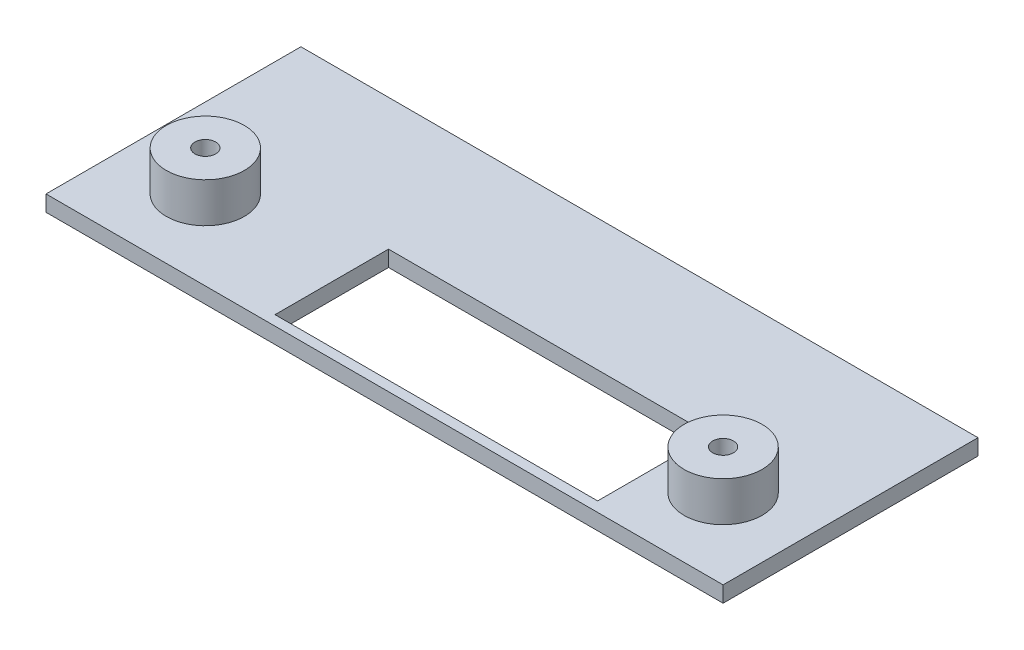
ISO-10303-21;
HEADER;
FILE_DESCRIPTION(('STEP AP214'),'2;1');
FILE_NAME('part.step','',(''),(''),'','','');
FILE_SCHEMA(('AUTOMOTIVE_DESIGN { 1 0 10303 214 1 1 1 1 }'));
ENDSEC;
DATA;
#1=APPLICATION_CONTEXT('core data for automotive mechanical design processes');
#2=APPLICATION_PROTOCOL_DEFINITION('international standard','automotive_design',2000,#1);
#3=PRODUCT_CONTEXT('',#1,'mechanical');
#4=PRODUCT('Part','Part','',(#3));
#5=PRODUCT_RELATED_PRODUCT_CATEGORY('part','',(#4));
#6=PRODUCT_DEFINITION_FORMATION('','',#4);
#7=PRODUCT_DEFINITION_CONTEXT('part definition',#1,'design');
#8=PRODUCT_DEFINITION('design','',#6,#7);
#9=PRODUCT_DEFINITION_SHAPE('','',#8);
#10=(LENGTH_UNIT() NAMED_UNIT(*) SI_UNIT(.MILLI.,.METRE.));
#11=(NAMED_UNIT(*) PLANE_ANGLE_UNIT() SI_UNIT($,.RADIAN.));
#12=(NAMED_UNIT(*) SI_UNIT($,.STERADIAN.) SOLID_ANGLE_UNIT());
#13=UNCERTAINTY_MEASURE_WITH_UNIT(LENGTH_MEASURE(1.E-05),#10,'distance_accuracy_value','');
#14=(GEOMETRIC_REPRESENTATION_CONTEXT(3) GLOBAL_UNCERTAINTY_ASSIGNED_CONTEXT((#13)) GLOBAL_UNIT_ASSIGNED_CONTEXT((#10,
#11,#12)) REPRESENTATION_CONTEXT('',''));
#15=CARTESIAN_POINT('',(0.,0.,0.));
#16=DIRECTION('',(0.,0.,1.));
#17=DIRECTION('',(1.,0.,0.));
#18=AXIS2_PLACEMENT_3D('',#15,#16,#17);
#19=CARTESIAN_POINT('',(0.,4.,0.));
#20=DIRECTION('',(0.,1.,0.));
#21=DIRECTION('',(0.,0.,1.));
#22=AXIS2_PLACEMENT_3D('',#19,#20,#21);
#23=PLANE('',#22);
#24=CARTESIAN_POINT('',(150.,4.,-19.9999999999995));
#25=DIRECTION('',(0.,1.,0.));
#26=DIRECTION('',(0.,0.,1.));
#27=AXIS2_PLACEMENT_3D('',#24,#25,#26);
#28=CIRCLE('',#27,9.79999999999999);
#29=CARTESIAN_POINT('',(150.,4.,-10.1999999999995));
#30=VERTEX_POINT('',#29);
#31=EDGE_CURVE('E218',#30,#30,#28,.T.);
#32=ORIENTED_EDGE('',*,*,#31,.F.);
#33=EDGE_LOOP('',(#32));
#34=FACE_BOUND('',#33,.T.);
#35=CARTESIAN_POINT('',(20.0000000000001,4.,-19.9999999999999));
#36=DIRECTION('',(0.,1.,0.));
#37=DIRECTION('',(0.,0.,1.));
#38=AXIS2_PLACEMENT_3D('',#35,#36,#37);
#39=CIRCLE('',#38,9.80000000000001);
#40=CARTESIAN_POINT('',(20.0000000000001,4.,-10.1999999999999));
#41=VERTEX_POINT('',#40);
#42=EDGE_CURVE('E247',#41,#41,#39,.T.);
#43=ORIENTED_EDGE('',*,*,#42,.F.);
#44=EDGE_LOOP('',(#43));
#45=FACE_BOUND('',#44,.T.);
#46=DIRECTION('',(1.,0.,0.));
#47=VECTOR('',#46,1.);
#48=CARTESIAN_POINT('',(0.,4.,0.));
#49=LINE('',#48,#47);
#50=CARTESIAN_POINT('',(0.,4.,0.));
#51=VERTEX_POINT('',#50);
#52=CARTESIAN_POINT('',(170.,4.,0.));
#53=VERTEX_POINT('',#52);
#54=EDGE_CURVE('E319',#51,#53,#49,.T.);
#55=ORIENTED_EDGE('',*,*,#54,.T.);
#56=DIRECTION('',(0.,0.,-1.));
#57=VECTOR('',#56,1.);
#58=CARTESIAN_POINT('',(170.,4.,0.));
#59=LINE('',#58,#57);
#60=CARTESIAN_POINT('',(170.,4.,-64.));
#61=VERTEX_POINT('',#60);
#62=EDGE_CURVE('E322',#53,#61,#59,.T.);
#63=ORIENTED_EDGE('',*,*,#62,.T.);
#64=DIRECTION('',(-1.,0.,0.));
#65=VECTOR('',#64,1.);
#66=CARTESIAN_POINT('',(0.,4.,-64.));
#67=LINE('',#66,#65);
#68=CARTESIAN_POINT('',(0.,4.,-64.));
#69=VERTEX_POINT('',#68);
#70=EDGE_CURVE('E325',#61,#69,#67,.T.);
#71=ORIENTED_EDGE('',*,*,#70,.T.);
#72=DIRECTION('',(0.,0.,1.));
#73=VECTOR('',#72,1.);
#74=CARTESIAN_POINT('',(0.,4.,0.));
#75=LINE('',#74,#73);
#76=EDGE_CURVE('E327',#69,#51,#75,.T.);
#77=ORIENTED_EDGE('',*,*,#76,.T.);
#78=EDGE_LOOP('',(#55,#63,#71,#77));
#79=FACE_BOUND('',#78,.T.);
#80=DIRECTION('',(0.,0.,1.));
#81=VECTOR('',#80,1.);
#82=CARTESIAN_POINT('',(55.0000000000001,4.,-30.9999999999998));
#83=LINE('',#82,#81);
#84=CARTESIAN_POINT('',(55.0000000000001,4.,-30.9999999999998));
#85=VERTEX_POINT('',#84);
#86=CARTESIAN_POINT('',(55.0000000000002,4.,-2.49999999999981));
#87=VERTEX_POINT('',#86);
#88=EDGE_CURVE('E295',#85,#87,#83,.T.);
#89=ORIENTED_EDGE('',*,*,#88,.F.);
#90=DIRECTION('',(-1.,0.,0.));
#91=VECTOR('',#90,1.);
#92=CARTESIAN_POINT('',(55.0000000000001,4.,-30.9999999999998));
#93=LINE('',#92,#91);
#94=CARTESIAN_POINT('',(136.,4.,-30.9999999999998));
#95=VERTEX_POINT('',#94);
#96=EDGE_CURVE('E293',#95,#85,#93,.T.);
#97=ORIENTED_EDGE('',*,*,#96,.F.);
#98=DIRECTION('',(0.,0.,-1.));
#99=VECTOR('',#98,1.);
#100=CARTESIAN_POINT('',(136.,4.,-30.9999999999998));
#101=LINE('',#100,#99);
#102=CARTESIAN_POINT('',(136.,4.,-2.49999999999981));
#103=VERTEX_POINT('',#102);
#104=EDGE_CURVE('E300',#103,#95,#101,.T.);
#105=ORIENTED_EDGE('',*,*,#104,.F.);
#106=DIRECTION('',(1.,0.,0.));
#107=VECTOR('',#106,1.);
#108=CARTESIAN_POINT('',(55.0000000000002,4.,-2.49999999999981));
#109=LINE('',#108,#107);
#110=EDGE_CURVE('E298',#87,#103,#109,.T.);
#111=ORIENTED_EDGE('',*,*,#110,.F.);
#112=EDGE_LOOP('',(#89,#97,#105,#111));
#113=FACE_BOUND('',#112,.T.);
#114=ADVANCED_FACE('F53',(#34,#45,#79,#113),#23,.T.);
#115=CARTESIAN_POINT('',(0.,0.,0.));
#116=DIRECTION('',(0.,1.,0.));
#117=DIRECTION('',(0.,0.,1.));
#118=AXIS2_PLACEMENT_3D('',#115,#116,#117);
#119=PLANE('',#118);
#120=DIRECTION('',(1.,0.,0.));
#121=VECTOR('',#120,1.);
#122=CARTESIAN_POINT('',(0.,0.,0.));
#123=LINE('',#122,#121);
#124=CARTESIAN_POINT('',(0.,0.,0.));
#125=VERTEX_POINT('',#124);
#126=CARTESIAN_POINT('',(170.,0.,0.));
#127=VERTEX_POINT('',#126);
#128=EDGE_CURVE('E318',#125,#127,#123,.T.);
#129=ORIENTED_EDGE('',*,*,#128,.F.);
#130=DIRECTION('',(0.,0.,1.));
#131=VECTOR('',#130,1.);
#132=CARTESIAN_POINT('',(0.,0.,0.));
#133=LINE('',#132,#131);
#134=CARTESIAN_POINT('',(0.,0.,-64.));
#135=VERTEX_POINT('',#134);
#136=EDGE_CURVE('E323',#135,#125,#133,.T.);
#137=ORIENTED_EDGE('',*,*,#136,.F.);
#138=DIRECTION('',(-1.,0.,0.));
#139=VECTOR('',#138,1.);
#140=CARTESIAN_POINT('',(0.,0.,-64.));
#141=LINE('',#140,#139);
#142=CARTESIAN_POINT('',(170.,0.,-64.));
#143=VERTEX_POINT('',#142);
#144=EDGE_CURVE('E334',#143,#135,#141,.T.);
#145=ORIENTED_EDGE('',*,*,#144,.F.);
#146=DIRECTION('',(0.,0.,-1.));
#147=VECTOR('',#146,1.);
#148=CARTESIAN_POINT('',(170.,0.,0.));
#149=LINE('',#148,#147);
#150=EDGE_CURVE('E332',#127,#143,#149,.T.);
#151=ORIENTED_EDGE('',*,*,#150,.F.);
#152=EDGE_LOOP('',(#129,#137,#145,#151));
#153=FACE_BOUND('',#152,.T.);
#154=DIRECTION('',(-1.,0.,0.));
#155=VECTOR('',#154,1.);
#156=CARTESIAN_POINT('',(55.0000000000001,0.,-30.9999999999998));
#157=LINE('',#156,#155);
#158=CARTESIAN_POINT('',(136.,0.,-30.9999999999998));
#159=VERTEX_POINT('',#158);
#160=CARTESIAN_POINT('',(55.0000000000001,0.,-30.9999999999998));
#161=VERTEX_POINT('',#160);
#162=EDGE_CURVE('E76',#159,#161,#157,.T.);
#163=ORIENTED_EDGE('',*,*,#162,.T.);
#164=DIRECTION('',(0.,0.,1.));
#165=VECTOR('',#164,1.);
#166=CARTESIAN_POINT('',(55.0000000000001,0.,-30.9999999999998));
#167=LINE('',#166,#165);
#168=CARTESIAN_POINT('',(55.0000000000002,0.,-2.49999999999981));
#169=VERTEX_POINT('',#168);
#170=EDGE_CURVE('E304',#161,#169,#167,.T.);
#171=ORIENTED_EDGE('',*,*,#170,.T.);
#172=DIRECTION('',(1.,0.,0.));
#173=VECTOR('',#172,1.);
#174=CARTESIAN_POINT('',(55.0000000000002,0.,-2.49999999999981));
#175=LINE('',#174,#173);
#176=CARTESIAN_POINT('',(136.,0.,-2.49999999999981));
#177=VERTEX_POINT('',#176);
#178=EDGE_CURVE('E307',#169,#177,#175,.T.);
#179=ORIENTED_EDGE('',*,*,#178,.T.);
#180=DIRECTION('',(0.,0.,-1.));
#181=VECTOR('',#180,1.);
#182=CARTESIAN_POINT('',(136.,0.,-30.9999999999998));
#183=LINE('',#182,#181);
#184=EDGE_CURVE('E296',#177,#159,#183,.T.);
#185=ORIENTED_EDGE('',*,*,#184,.T.);
#186=EDGE_LOOP('',(#163,#171,#179,#185));
#187=FACE_BOUND('',#186,.T.);
#188=DIRECTION('',(0.500000000000001,0.,-0.866025403784438));
#189=VECTOR('',#188,1.);
#190=CARTESIAN_POINT('',(10.2801615493749,0.,5.93525403784445));
#191=LINE('',#190,#189);
#192=CARTESIAN_POINT('',(22.6269437248129,0.,-15.4499999999999));
#193=VERTEX_POINT('',#192);
#194=CARTESIAN_POINT('',(25.2538874496257,0.,-19.9999999999999));
#195=VERTEX_POINT('',#194);
#196=EDGE_CURVE('E253',#193,#195,#191,.T.);
#197=ORIENTED_EDGE('',*,*,#196,.T.);
#198=DIRECTION('',(-0.5,0.,-0.866025403784439));
#199=VECTOR('',#198,1.);
#200=CARTESIAN_POINT('',(27.6006696250636,0.,-15.9352540378444));
#201=LINE('',#200,#199);
#202=CARTESIAN_POINT('',(22.6269437248129,0.,-24.5499999999999));
#203=VERTEX_POINT('',#202);
#204=EDGE_CURVE('E261',#195,#203,#201,.T.);
#205=ORIENTED_EDGE('',*,*,#204,.T.);
#206=DIRECTION('',(-1.,0.,0.));
#207=VECTOR('',#206,1.);
#208=CARTESIAN_POINT('',(0.,0.,-24.55));
#209=LINE('',#208,#207);
#210=CARTESIAN_POINT('',(17.3730562751873,0.,-24.5499999999999));
#211=VERTEX_POINT('',#210);
#212=EDGE_CURVE('E259',#203,#211,#209,.T.);
#213=ORIENTED_EDGE('',*,*,#212,.T.);
#214=DIRECTION('',(-0.500000000000001,0.,0.866025403784438));
#215=VECTOR('',#214,1.);
#216=CARTESIAN_POINT('',(2.39933037493649,0.,1.38525403784443));
#217=LINE('',#216,#215);
#218=CARTESIAN_POINT('',(14.7461125503745,0.,-19.9999999999999));
#219=VERTEX_POINT('',#218);
#220=EDGE_CURVE('E256',#211,#219,#217,.T.);
#221=ORIENTED_EDGE('',*,*,#220,.T.);
#222=DIRECTION('',(0.499999999999999,0.,0.866025403784439));
#223=VECTOR('',#222,1.);
#224=CARTESIAN_POINT('',(19.7198384506252,0.,-11.3852540378444));
#225=LINE('',#224,#223);
#226=CARTESIAN_POINT('',(17.3730562751873,0.,-15.4499999999999));
#227=VERTEX_POINT('',#226);
#228=EDGE_CURVE('E254',#219,#227,#225,.T.);
#229=ORIENTED_EDGE('',*,*,#228,.T.);
#230=DIRECTION('',(1.,0.,0.));
#231=VECTOR('',#230,1.);
#232=CARTESIAN_POINT('',(0.,0.,-15.4499999999999));
#233=LINE('',#232,#231);
#234=EDGE_CURVE('E251',#227,#193,#233,.T.);
#235=ORIENTED_EDGE('',*,*,#234,.T.);
#236=EDGE_LOOP('',(#197,#205,#213,#221,#229,#235));
#237=FACE_BOUND('',#236,.T.);
#238=DIRECTION('',(0.500000000000003,0.,-0.866025403784437));
#239=VECTOR('',#238,1.);
#240=CARTESIAN_POINT('',(107.780161549375,0.,62.2269052838333));
#241=LINE('',#240,#239);
#242=CARTESIAN_POINT('',(152.626943724813,0.,-15.4499999999995));
#243=VERTEX_POINT('',#242);
#244=CARTESIAN_POINT('',(155.253887449626,0.,-19.9999999999995));
#245=VERTEX_POINT('',#244);
#246=EDGE_CURVE('E212',#243,#245,#241,.T.);
#247=ORIENTED_EDGE('',*,*,#246,.T.);
#248=DIRECTION('',(-0.499999999999999,0.,-0.866025403784439));
#249=VECTOR('',#248,1.);
#250=CARTESIAN_POINT('',(125.100669625064,0.,-72.2269052838328));
#251=LINE('',#250,#249);
#252=CARTESIAN_POINT('',(152.626943724813,0.,-24.5499999999995));
#253=VERTEX_POINT('',#252);
#254=EDGE_CURVE('E497',#245,#253,#251,.T.);
#255=ORIENTED_EDGE('',*,*,#254,.T.);
#256=DIRECTION('',(-1.,0.,0.));
#257=VECTOR('',#256,1.);
#258=CARTESIAN_POINT('',(0.,0.,-24.5499999999995));
#259=LINE('',#258,#257);
#260=CARTESIAN_POINT('',(147.373056275187,0.,-24.5499999999995));
#261=VERTEX_POINT('',#260);
#262=EDGE_CURVE('E496',#253,#261,#259,.T.);
#263=ORIENTED_EDGE('',*,*,#262,.T.);
#264=DIRECTION('',(-0.500000000000003,0.,0.866025403784437));
#265=VECTOR('',#264,1.);
#266=CARTESIAN_POINT('',(99.8993303749363,0.,57.6769052838333));
#267=LINE('',#266,#265);
#268=CARTESIAN_POINT('',(144.746112550375,0.,-19.9999999999995));
#269=VERTEX_POINT('',#268);
#270=EDGE_CURVE('E494',#261,#269,#267,.T.);
#271=ORIENTED_EDGE('',*,*,#270,.T.);
#272=DIRECTION('',(0.499999999999999,0.,0.866025403784439));
#273=VECTOR('',#272,1.);
#274=CARTESIAN_POINT('',(117.219838450625,0.,-67.6769052838328));
#275=LINE('',#274,#273);
#276=CARTESIAN_POINT('',(147.373056275187,0.,-15.4499999999995));
#277=VERTEX_POINT('',#276);
#278=EDGE_CURVE('E242',#269,#277,#275,.T.);
#279=ORIENTED_EDGE('',*,*,#278,.T.);
#280=DIRECTION('',(1.,0.,0.));
#281=VECTOR('',#280,1.);
#282=CARTESIAN_POINT('',(0.,0.,-15.4499999999996));
#283=LINE('',#282,#281);
#284=EDGE_CURVE('E250',#277,#243,#283,.T.);
#285=ORIENTED_EDGE('',*,*,#284,.T.);
#286=EDGE_LOOP('',(#247,#255,#263,#271,#279,#285));
#287=FACE_BOUND('',#286,.T.);
#288=ADVANCED_FACE('F352',(#153,#187,#237,#287),#119,.F.);
#289=CARTESIAN_POINT('',(0.,4.,0.));
#290=DIRECTION('',(0.,0.,-1.));
#291=DIRECTION('',(-1.,0.,0.));
#292=AXIS2_PLACEMENT_3D('',#289,#290,#291);
#293=PLANE('',#292);
#294=ORIENTED_EDGE('',*,*,#128,.T.);
#295=DIRECTION('',(0.,-1.,0.));
#296=VECTOR('',#295,1.);
#297=CARTESIAN_POINT('',(170.,4.,0.));
#298=LINE('',#297,#296);
#299=EDGE_CURVE('E12',#53,#127,#298,.T.);
#300=ORIENTED_EDGE('',*,*,#299,.F.);
#301=ORIENTED_EDGE('',*,*,#54,.F.);
#302=DIRECTION('',(0.,-1.,0.));
#303=VECTOR('',#302,1.);
#304=CARTESIAN_POINT('',(0.,4.,0.));
#305=LINE('',#304,#303);
#306=EDGE_CURVE('E329',#51,#125,#305,.T.);
#307=ORIENTED_EDGE('',*,*,#306,.T.);
#308=EDGE_LOOP('',(#294,#300,#301,#307));
#309=FACE_BOUND('',#308,.T.);
#310=ADVANCED_FACE('F55',(#309),#293,.F.);
#311=CARTESIAN_POINT('',(170.,4.,0.));
#312=DIRECTION('',(-1.,0.,0.));
#313=DIRECTION('',(0.,0.,1.));
#314=AXIS2_PLACEMENT_3D('',#311,#312,#313);
#315=PLANE('',#314);
#316=ORIENTED_EDGE('',*,*,#150,.T.);
#317=DIRECTION('',(0.,-1.,0.));
#318=VECTOR('',#317,1.);
#319=CARTESIAN_POINT('',(170.,4.,-64.));
#320=LINE('',#319,#318);
#321=EDGE_CURVE('E61',#61,#143,#320,.T.);
#322=ORIENTED_EDGE('',*,*,#321,.F.);
#323=ORIENTED_EDGE('',*,*,#62,.F.);
#324=ORIENTED_EDGE('',*,*,#299,.T.);
#325=EDGE_LOOP('',(#316,#322,#323,#324));
#326=FACE_BOUND('',#325,.T.);
#327=ADVANCED_FACE('F363',(#326),#315,.F.);
#328=CARTESIAN_POINT('',(0.,4.,-64.));
#329=DIRECTION('',(0.,0.,1.));
#330=DIRECTION('',(1.,0.,0.));
#331=AXIS2_PLACEMENT_3D('',#328,#329,#330);
#332=PLANE('',#331);
#333=ORIENTED_EDGE('',*,*,#144,.T.);
#334=DIRECTION('',(0.,-1.,0.));
#335=VECTOR('',#334,1.);
#336=CARTESIAN_POINT('',(0.,4.,-64.));
#337=LINE('',#336,#335);
#338=EDGE_CURVE('E339',#69,#135,#337,.T.);
#339=ORIENTED_EDGE('',*,*,#338,.F.);
#340=ORIENTED_EDGE('',*,*,#70,.F.);
#341=ORIENTED_EDGE('',*,*,#321,.T.);
#342=EDGE_LOOP('',(#333,#339,#340,#341));
#343=FACE_BOUND('',#342,.T.);
#344=ADVANCED_FACE('F346',(#343),#332,.F.);
#345=CARTESIAN_POINT('',(0.,4.,0.));
#346=DIRECTION('',(1.,0.,0.));
#347=DIRECTION('',(0.,0.,-1.));
#348=AXIS2_PLACEMENT_3D('',#345,#346,#347);
#349=PLANE('',#348);
#350=ORIENTED_EDGE('',*,*,#136,.T.);
#351=ORIENTED_EDGE('',*,*,#306,.F.);
#352=ORIENTED_EDGE('',*,*,#76,.F.);
#353=ORIENTED_EDGE('',*,*,#338,.T.);
#354=EDGE_LOOP('',(#350,#351,#352,#353));
#355=FACE_BOUND('',#354,.T.);
#356=ADVANCED_FACE('F356',(#355),#349,.F.);
#357=CARTESIAN_POINT('',(55.0000000000001,4.,-30.9999999999998));
#358=DIRECTION('',(0.,0.,1.));
#359=DIRECTION('',(1.,0.,0.));
#360=AXIS2_PLACEMENT_3D('',#357,#358,#359);
#361=PLANE('',#360);
#362=ORIENTED_EDGE('',*,*,#162,.F.);
#363=DIRECTION('',(0.,-1.,0.));
#364=VECTOR('',#363,1.);
#365=CARTESIAN_POINT('',(136.,4.,-30.9999999999998));
#366=LINE('',#365,#364);
#367=EDGE_CURVE('E302',#95,#159,#366,.T.);
#368=ORIENTED_EDGE('',*,*,#367,.F.);
#369=ORIENTED_EDGE('',*,*,#96,.T.);
#370=DIRECTION('',(0.,-1.,0.));
#371=VECTOR('',#370,1.);
#372=CARTESIAN_POINT('',(55.0000000000001,4.,-30.9999999999998));
#373=LINE('',#372,#371);
#374=EDGE_CURVE('E316',#85,#161,#373,.T.);
#375=ORIENTED_EDGE('',*,*,#374,.T.);
#376=EDGE_LOOP('',(#362,#368,#369,#375));
#377=FACE_BOUND('',#376,.T.);
#378=ADVANCED_FACE('F380',(#377),#361,.T.);
#379=CARTESIAN_POINT('',(55.0000000000001,4.,-30.9999999999998));
#380=DIRECTION('',(1.,0.,0.));
#381=DIRECTION('',(0.,0.,-1.));
#382=AXIS2_PLACEMENT_3D('',#379,#380,#381);
#383=PLANE('',#382);
#384=ORIENTED_EDGE('',*,*,#170,.F.);
#385=ORIENTED_EDGE('',*,*,#374,.F.);
#386=ORIENTED_EDGE('',*,*,#88,.T.);
#387=DIRECTION('',(0.,-1.,0.));
#388=VECTOR('',#387,1.);
#389=CARTESIAN_POINT('',(55.0000000000002,4.,-2.49999999999981));
#390=LINE('',#389,#388);
#391=EDGE_CURVE('E314',#87,#169,#390,.T.);
#392=ORIENTED_EDGE('',*,*,#391,.T.);
#393=EDGE_LOOP('',(#384,#385,#386,#392));
#394=FACE_BOUND('',#393,.T.);
#395=ADVANCED_FACE('F387',(#394),#383,.T.);
#396=CARTESIAN_POINT('',(55.0000000000002,4.,-2.49999999999981));
#397=DIRECTION('',(0.,0.,-1.));
#398=DIRECTION('',(-1.,0.,0.));
#399=AXIS2_PLACEMENT_3D('',#396,#397,#398);
#400=PLANE('',#399);
#401=ORIENTED_EDGE('',*,*,#178,.F.);
#402=ORIENTED_EDGE('',*,*,#391,.F.);
#403=ORIENTED_EDGE('',*,*,#110,.T.);
#404=DIRECTION('',(0.,-1.,0.));
#405=VECTOR('',#404,1.);
#406=CARTESIAN_POINT('',(136.,4.,-2.49999999999981));
#407=LINE('',#406,#405);
#408=EDGE_CURVE('E68',#103,#177,#407,.T.);
#409=ORIENTED_EDGE('',*,*,#408,.T.);
#410=EDGE_LOOP('',(#401,#402,#403,#409));
#411=FACE_BOUND('',#410,.T.);
#412=ADVANCED_FACE('F391',(#411),#400,.T.);
#413=CARTESIAN_POINT('',(136.,4.,-30.9999999999998));
#414=DIRECTION('',(-1.,0.,0.));
#415=DIRECTION('',(0.,0.,1.));
#416=AXIS2_PLACEMENT_3D('',#413,#414,#415);
#417=PLANE('',#416);
#418=ORIENTED_EDGE('',*,*,#184,.F.);
#419=ORIENTED_EDGE('',*,*,#408,.F.);
#420=ORIENTED_EDGE('',*,*,#104,.T.);
#421=ORIENTED_EDGE('',*,*,#367,.T.);
#422=EDGE_LOOP('',(#418,#419,#420,#421));
#423=FACE_BOUND('',#422,.T.);
#424=ADVANCED_FACE('F396',(#423),#417,.T.);
#425=CARTESIAN_POINT('',(0.,-27.7185858225127,-15.4499999999999));
#426=DIRECTION('',(0.,0.,-1.));
#427=DIRECTION('',(-1.,0.,0.));
#428=AXIS2_PLACEMENT_3D('',#425,#426,#427);
#429=PLANE('',#428);
#430=ORIENTED_EDGE('',*,*,#234,.F.);
#431=DIRECTION('',(0.,1.,0.));
#432=VECTOR('',#431,1.);
#433=CARTESIAN_POINT('',(17.3730562751873,-27.7185858225127,-15.4499999999999));
#434=LINE('',#433,#432);
#435=CARTESIAN_POINT('',(17.3730562751873,4.,-15.4499999999999));
#436=VERTEX_POINT('',#435);
#437=EDGE_CURVE('E284',#227,#436,#434,.T.);
#438=ORIENTED_EDGE('',*,*,#437,.T.);
#439=DIRECTION('',(-1.,0.,0.));
#440=VECTOR('',#439,1.);
#441=CARTESIAN_POINT('',(0.,4.,-15.4499999999999));
#442=LINE('',#441,#440);
#443=CARTESIAN_POINT('',(22.6269437248129,4.,-15.4499999999999));
#444=VERTEX_POINT('',#443);
#445=EDGE_CURVE('E278',#444,#436,#442,.T.);
#446=ORIENTED_EDGE('',*,*,#445,.F.);
#447=DIRECTION('',(0.,1.,0.));
#448=VECTOR('',#447,1.);
#449=CARTESIAN_POINT('',(22.6269437248129,-27.7185858225127,-15.4499999999999));
#450=LINE('',#449,#448);
#451=EDGE_CURVE('E281',#193,#444,#450,.T.);
#452=ORIENTED_EDGE('',*,*,#451,.F.);
#453=EDGE_LOOP('',(#430,#438,#446,#452));
#454=FACE_BOUND('',#453,.T.);
#455=ADVANCED_FACE('F402',(#454),#429,.T.);
#456=CARTESIAN_POINT('',(19.7198384506252,-27.7185858225127,-11.3852540378444));
#457=DIRECTION('',(0.866025403784439,0.,-0.499999999999999));
#458=DIRECTION('',(-0.499999999999999,0.,-0.866025403784439));
#459=AXIS2_PLACEMENT_3D('',#456,#457,#458);
#460=PLANE('',#459);
#461=ORIENTED_EDGE('',*,*,#228,.F.);
#462=DIRECTION('',(0.,1.,0.));
#463=VECTOR('',#462,1.);
#464=CARTESIAN_POINT('',(14.7461125503745,-27.7185858225127,-19.9999999999999));
#465=LINE('',#464,#463);
#466=CARTESIAN_POINT('',(14.7461125503745,4.,-19.9999999999999));
#467=VERTEX_POINT('',#466);
#468=EDGE_CURVE('E286',#219,#467,#465,.T.);
#469=ORIENTED_EDGE('',*,*,#468,.T.);
#470=DIRECTION('',(-0.499999999999999,0.,-0.866025403784439));
#471=VECTOR('',#470,1.);
#472=CARTESIAN_POINT('',(19.7198384506252,4.,-11.3852540378444));
#473=LINE('',#472,#471);
#474=EDGE_CURVE('E275',#436,#467,#473,.T.);
#475=ORIENTED_EDGE('',*,*,#474,.F.);
#476=ORIENTED_EDGE('',*,*,#437,.F.);
#477=EDGE_LOOP('',(#461,#469,#475,#476));
#478=FACE_BOUND('',#477,.T.);
#479=ADVANCED_FACE('F419',(#478),#460,.T.);
#480=CARTESIAN_POINT('',(2.39933037493649,-27.7185858225127,1.38525403784443));
#481=DIRECTION('',(0.866025403784438,0.,0.500000000000001));
#482=DIRECTION('',(0.500000000000001,0.,-0.866025403784438));
#483=AXIS2_PLACEMENT_3D('',#480,#481,#482);
#484=PLANE('',#483);
#485=ORIENTED_EDGE('',*,*,#220,.F.);
#486=DIRECTION('',(0.,1.,0.));
#487=VECTOR('',#486,1.);
#488=CARTESIAN_POINT('',(17.3730562751873,-27.7185858225127,-24.5499999999999));
#489=LINE('',#488,#487);
#490=CARTESIAN_POINT('',(17.3730562751873,4.,-24.5499999999999));
#491=VERTEX_POINT('',#490);
#492=EDGE_CURVE('E288',#211,#491,#489,.T.);
#493=ORIENTED_EDGE('',*,*,#492,.T.);
#494=DIRECTION('',(0.500000000000001,0.,-0.866025403784438));
#495=VECTOR('',#494,1.);
#496=CARTESIAN_POINT('',(2.39933037493649,4.,1.38525403784443));
#497=LINE('',#496,#495);
#498=EDGE_CURVE('E272',#467,#491,#497,.T.);
#499=ORIENTED_EDGE('',*,*,#498,.F.);
#500=ORIENTED_EDGE('',*,*,#468,.F.);
#501=EDGE_LOOP('',(#485,#493,#499,#500));
#502=FACE_BOUND('',#501,.T.);
#503=ADVANCED_FACE('F415',(#502),#484,.T.);
#504=CARTESIAN_POINT('',(0.,-27.7185858225127,-24.55));
#505=DIRECTION('',(0.,0.,1.));
#506=DIRECTION('',(1.,0.,0.));
#507=AXIS2_PLACEMENT_3D('',#504,#505,#506);
#508=PLANE('',#507);
#509=ORIENTED_EDGE('',*,*,#212,.F.);
#510=DIRECTION('',(0.,1.,0.));
#511=VECTOR('',#510,1.);
#512=CARTESIAN_POINT('',(22.6269437248129,-27.7185858225127,-24.5499999999999));
#513=LINE('',#512,#511);
#514=CARTESIAN_POINT('',(22.6269437248129,4.,-24.5499999999999));
#515=VERTEX_POINT('',#514);
#516=EDGE_CURVE('E290',#203,#515,#513,.T.);
#517=ORIENTED_EDGE('',*,*,#516,.T.);
#518=DIRECTION('',(1.,0.,0.));
#519=VECTOR('',#518,1.);
#520=CARTESIAN_POINT('',(0.,4.,-24.55));
#521=LINE('',#520,#519);
#522=EDGE_CURVE('E269',#491,#515,#521,.T.);
#523=ORIENTED_EDGE('',*,*,#522,.F.);
#524=ORIENTED_EDGE('',*,*,#492,.F.);
#525=EDGE_LOOP('',(#509,#517,#523,#524));
#526=FACE_BOUND('',#525,.T.);
#527=ADVANCED_FACE('F411',(#526),#508,.T.);
#528=CARTESIAN_POINT('',(27.6006696250636,-27.7185858225127,-15.9352540378444));
#529=DIRECTION('',(-0.866025403784439,0.,0.5));
#530=DIRECTION('',(0.5,0.,0.866025403784439));
#531=AXIS2_PLACEMENT_3D('',#528,#529,#530);
#532=PLANE('',#531);
#533=ORIENTED_EDGE('',*,*,#204,.F.);
#534=DIRECTION('',(0.,1.,0.));
#535=VECTOR('',#534,1.);
#536=CARTESIAN_POINT('',(25.2538874496257,-27.7185858225127,-19.9999999999999));
#537=LINE('',#536,#535);
#538=CARTESIAN_POINT('',(25.2538874496257,4.,-19.9999999999999));
#539=VERTEX_POINT('',#538);
#540=EDGE_CURVE('E257',#195,#539,#537,.T.);
#541=ORIENTED_EDGE('',*,*,#540,.T.);
#542=DIRECTION('',(0.5,0.,0.866025403784439));
#543=VECTOR('',#542,1.);
#544=CARTESIAN_POINT('',(27.6006696250636,4.,-15.9352540378444));
#545=LINE('',#544,#543);
#546=EDGE_CURVE('E266',#515,#539,#545,.T.);
#547=ORIENTED_EDGE('',*,*,#546,.F.);
#548=ORIENTED_EDGE('',*,*,#516,.F.);
#549=EDGE_LOOP('',(#533,#541,#547,#548));
#550=FACE_BOUND('',#549,.T.);
#551=ADVANCED_FACE('F407',(#550),#532,.T.);
#552=CARTESIAN_POINT('',(10.2801615493749,-27.7185858225127,5.93525403784445));
#553=DIRECTION('',(-0.866025403784438,0.,-0.500000000000001));
#554=DIRECTION('',(-0.500000000000001,0.,0.866025403784438));
#555=AXIS2_PLACEMENT_3D('',#552,#553,#554);
#556=PLANE('',#555);
#557=ORIENTED_EDGE('',*,*,#196,.F.);
#558=ORIENTED_EDGE('',*,*,#451,.T.);
#559=DIRECTION('',(-0.500000000000001,0.,0.866025403784438));
#560=VECTOR('',#559,1.);
#561=CARTESIAN_POINT('',(10.2801615493749,4.,5.93525403784445));
#562=LINE('',#561,#560);
#563=EDGE_CURVE('E246',#539,#444,#562,.T.);
#564=ORIENTED_EDGE('',*,*,#563,.F.);
#565=ORIENTED_EDGE('',*,*,#540,.F.);
#566=EDGE_LOOP('',(#557,#558,#564,#565));
#567=FACE_BOUND('',#566,.T.);
#568=ADVANCED_FACE('F403',(#567),#556,.T.);
#569=CARTESIAN_POINT('',(20.0000000000001,4.,-19.9999999999999));
#570=DIRECTION('',(0.,1.,0.));
#571=DIRECTION('',(0.,0.,1.));
#572=AXIS2_PLACEMENT_3D('',#569,#570,#571);
#573=PLANE('',#572);
#574=CARTESIAN_POINT('',(20.0000000000001,4.,-19.9999999999999));
#575=DIRECTION('',(0.,1.,0.));
#576=DIRECTION('',(0.,0.,1.));
#577=AXIS2_PLACEMENT_3D('',#574,#575,#576);
#578=CIRCLE('',#577,2.6);
#579=CARTESIAN_POINT('',(20.0000000000001,4.,-17.3999999999999));
#580=VERTEX_POINT('',#579);
#581=EDGE_CURVE('E484',#580,#580,#578,.T.);
#582=ORIENTED_EDGE('',*,*,#581,.T.);
#583=EDGE_LOOP('',(#582));
#584=FACE_BOUND('',#583,.T.);
#585=ORIENTED_EDGE('',*,*,#445,.T.);
#586=ORIENTED_EDGE('',*,*,#474,.T.);
#587=ORIENTED_EDGE('',*,*,#498,.T.);
#588=ORIENTED_EDGE('',*,*,#522,.T.);
#589=ORIENTED_EDGE('',*,*,#546,.T.);
#590=ORIENTED_EDGE('',*,*,#563,.T.);
#591=EDGE_LOOP('',(#585,#586,#587,#588,#589,#590));
#592=FACE_BOUND('',#591,.T.);
#593=ADVANCED_FACE('F406',(#584,#592),#573,.F.);
#594=CARTESIAN_POINT('',(20.0000000000001,14.,-19.9999999999999));
#595=DIRECTION('',(0.,-1.,0.));
#596=DIRECTION('',(0.,0.,-1.));
#597=AXIS2_PLACEMENT_3D('',#594,#595,#596);
#598=CYLINDRICAL_SURFACE('',#597,9.80000000000001);
#599=CARTESIAN_POINT('',(20.0000000000001,14.,-19.9999999999999));
#600=DIRECTION('',(0.,1.,0.));
#601=DIRECTION('',(0.,0.,1.));
#602=AXIS2_PLACEMENT_3D('',#599,#600,#601);
#603=CIRCLE('',#602,9.80000000000001);
#604=CARTESIAN_POINT('',(20.0000000000001,14.,-10.1999999999999));
#605=VERTEX_POINT('',#604);
#606=EDGE_CURVE('E243',#605,#605,#603,.T.);
#607=ORIENTED_EDGE('',*,*,#606,.F.);
#608=EDGE_LOOP('',(#607));
#609=FACE_BOUND('',#608,.T.);
#610=ORIENTED_EDGE('',*,*,#42,.T.);
#611=EDGE_LOOP('',(#610));
#612=FACE_BOUND('',#611,.T.);
#613=ADVANCED_FACE('F427',(#609,#612),#598,.T.);
#614=CARTESIAN_POINT('',(20.0000000000001,14.,-19.9999999999999));
#615=DIRECTION('',(0.,1.,0.));
#616=DIRECTION('',(0.,0.,1.));
#617=AXIS2_PLACEMENT_3D('',#614,#615,#616);
#618=PLANE('',#617);
#619=CARTESIAN_POINT('',(20.0000000000001,14.,-19.9999999999999));
#620=DIRECTION('',(0.,1.,0.));
#621=DIRECTION('',(0.,0.,1.));
#622=AXIS2_PLACEMENT_3D('',#619,#620,#621);
#623=CIRCLE('',#622,2.6);
#624=CARTESIAN_POINT('',(20.0000000000001,14.,-17.3999999999999));
#625=VERTEX_POINT('',#624);
#626=EDGE_CURVE('E481',#625,#625,#623,.T.);
#627=ORIENTED_EDGE('',*,*,#626,.F.);
#628=EDGE_LOOP('',(#627));
#629=FACE_BOUND('',#628,.T.);
#630=ORIENTED_EDGE('',*,*,#606,.T.);
#631=EDGE_LOOP('',(#630));
#632=FACE_BOUND('',#631,.T.);
#633=ADVANCED_FACE('F430',(#629,#632),#618,.T.);
#634=CARTESIAN_POINT('',(0.,-27.7185858225127,-15.4499999999996));
#635=DIRECTION('',(0.,0.,-1.));
#636=DIRECTION('',(-1.,0.,0.));
#637=AXIS2_PLACEMENT_3D('',#634,#635,#636);
#638=PLANE('',#637);
#639=ORIENTED_EDGE('',*,*,#284,.F.);
#640=DIRECTION('',(0.,1.,0.));
#641=VECTOR('',#640,1.);
#642=CARTESIAN_POINT('',(147.373056275187,-27.7185858225127,-15.4499999999995));
#643=LINE('',#642,#641);
#644=CARTESIAN_POINT('',(147.373056275187,4.,-15.4499999999995));
#645=VERTEX_POINT('',#644);
#646=EDGE_CURVE('E198',#277,#645,#643,.T.);
#647=ORIENTED_EDGE('',*,*,#646,.T.);
#648=DIRECTION('',(-1.,0.,0.));
#649=VECTOR('',#648,1.);
#650=CARTESIAN_POINT('',(0.,4.,-15.4499999999996));
#651=LINE('',#650,#649);
#652=CARTESIAN_POINT('',(152.626943724813,4.,-15.4499999999995));
#653=VERTEX_POINT('',#652);
#654=EDGE_CURVE('E192',#653,#645,#651,.T.);
#655=ORIENTED_EDGE('',*,*,#654,.F.);
#656=DIRECTION('',(0.,1.,0.));
#657=VECTOR('',#656,1.);
#658=CARTESIAN_POINT('',(152.626943724813,-27.7185858225127,-15.4499999999995));
#659=LINE('',#658,#657);
#660=EDGE_CURVE('E196',#243,#653,#659,.T.);
#661=ORIENTED_EDGE('',*,*,#660,.F.);
#662=EDGE_LOOP('',(#639,#647,#655,#661));
#663=FACE_BOUND('',#662,.T.);
#664=ADVANCED_FACE('F195',(#663),#638,.T.);
#665=CARTESIAN_POINT('',(117.219838450625,-27.7185858225127,-67.6769052838328));
#666=DIRECTION('',(0.866025403784439,0.,-0.499999999999999));
#667=DIRECTION('',(-0.499999999999999,0.,-0.866025403784439));
#668=AXIS2_PLACEMENT_3D('',#665,#666,#667);
#669=PLANE('',#668);
#670=ORIENTED_EDGE('',*,*,#278,.F.);
#671=DIRECTION('',(0.,1.,0.));
#672=VECTOR('',#671,1.);
#673=CARTESIAN_POINT('',(144.746112550375,-27.7185858225127,-19.9999999999995));
#674=LINE('',#673,#672);
#675=CARTESIAN_POINT('',(144.746112550375,4.,-19.9999999999995));
#676=VERTEX_POINT('',#675);
#677=EDGE_CURVE('E234',#269,#676,#674,.T.);
#678=ORIENTED_EDGE('',*,*,#677,.T.);
#679=DIRECTION('',(-0.499999999999999,0.,-0.866025403784439));
#680=VECTOR('',#679,1.);
#681=CARTESIAN_POINT('',(117.219838450625,4.,-67.6769052838328));
#682=LINE('',#681,#680);
#683=EDGE_CURVE('E203',#645,#676,#682,.T.);
#684=ORIENTED_EDGE('',*,*,#683,.F.);
#685=ORIENTED_EDGE('',*,*,#646,.F.);
#686=EDGE_LOOP('',(#670,#678,#684,#685));
#687=FACE_BOUND('',#686,.T.);
#688=ADVANCED_FACE('F451',(#687),#669,.T.);
#689=CARTESIAN_POINT('',(99.8993303749363,-27.7185858225127,57.6769052838333));
#690=DIRECTION('',(0.866025403784437,0.,0.500000000000003));
#691=DIRECTION('',(0.500000000000003,0.,-0.866025403784437));
#692=AXIS2_PLACEMENT_3D('',#689,#690,#691);
#693=PLANE('',#692);
#694=ORIENTED_EDGE('',*,*,#270,.F.);
#695=DIRECTION('',(0.,1.,0.));
#696=VECTOR('',#695,1.);
#697=CARTESIAN_POINT('',(147.373056275187,-27.7185858225127,-24.5499999999995));
#698=LINE('',#697,#696);
#699=CARTESIAN_POINT('',(147.373056275187,4.,-24.5499999999995));
#700=VERTEX_POINT('',#699);
#701=EDGE_CURVE('E236',#261,#700,#698,.T.);
#702=ORIENTED_EDGE('',*,*,#701,.T.);
#703=DIRECTION('',(0.500000000000003,0.,-0.866025403784437));
#704=VECTOR('',#703,1.);
#705=CARTESIAN_POINT('',(99.8993303749363,4.,57.6769052838333));
#706=LINE('',#705,#704);
#707=EDGE_CURVE('E229',#676,#700,#706,.T.);
#708=ORIENTED_EDGE('',*,*,#707,.F.);
#709=ORIENTED_EDGE('',*,*,#677,.F.);
#710=EDGE_LOOP('',(#694,#702,#708,#709));
#711=FACE_BOUND('',#710,.T.);
#712=ADVANCED_FACE('F447',(#711),#693,.T.);
#713=CARTESIAN_POINT('',(0.,-27.7185858225127,-24.5499999999995));
#714=DIRECTION('',(0.,0.,1.));
#715=DIRECTION('',(1.,0.,0.));
#716=AXIS2_PLACEMENT_3D('',#713,#714,#715);
#717=PLANE('',#716);
#718=ORIENTED_EDGE('',*,*,#262,.F.);
#719=DIRECTION('',(0.,1.,0.));
#720=VECTOR('',#719,1.);
#721=CARTESIAN_POINT('',(152.626943724813,-27.7185858225127,-24.5499999999995));
#722=LINE('',#721,#720);
#723=CARTESIAN_POINT('',(152.626943724813,4.,-24.5499999999995));
#724=VERTEX_POINT('',#723);
#725=EDGE_CURVE('E238',#253,#724,#722,.T.);
#726=ORIENTED_EDGE('',*,*,#725,.T.);
#727=DIRECTION('',(1.,0.,0.));
#728=VECTOR('',#727,1.);
#729=CARTESIAN_POINT('',(0.,4.,-24.5499999999995));
#730=LINE('',#729,#728);
#731=EDGE_CURVE('E220',#700,#724,#730,.T.);
#732=ORIENTED_EDGE('',*,*,#731,.F.);
#733=ORIENTED_EDGE('',*,*,#701,.F.);
#734=EDGE_LOOP('',(#718,#726,#732,#733));
#735=FACE_BOUND('',#734,.T.);
#736=ADVANCED_FACE('F443',(#735),#717,.T.);
#737=CARTESIAN_POINT('',(125.100669625064,-27.7185858225127,-72.2269052838328));
#738=DIRECTION('',(-0.866025403784439,0.,0.499999999999999));
#739=DIRECTION('',(0.499999999999999,0.,0.866025403784439));
#740=AXIS2_PLACEMENT_3D('',#737,#738,#739);
#741=PLANE('',#740);
#742=ORIENTED_EDGE('',*,*,#254,.F.);
#743=DIRECTION('',(0.,1.,0.));
#744=VECTOR('',#743,1.);
#745=CARTESIAN_POINT('',(155.253887449626,-27.7185858225127,-19.9999999999995));
#746=LINE('',#745,#744);
#747=CARTESIAN_POINT('',(155.253887449626,4.,-19.9999999999995));
#748=VERTEX_POINT('',#747);
#749=EDGE_CURVE('E240',#245,#748,#746,.T.);
#750=ORIENTED_EDGE('',*,*,#749,.T.);
#751=DIRECTION('',(0.499999999999999,0.,0.866025403784439));
#752=VECTOR('',#751,1.);
#753=CARTESIAN_POINT('',(125.100669625064,4.,-72.2269052838328));
#754=LINE('',#753,#752);
#755=EDGE_CURVE('E217',#724,#748,#754,.T.);
#756=ORIENTED_EDGE('',*,*,#755,.F.);
#757=ORIENTED_EDGE('',*,*,#725,.F.);
#758=EDGE_LOOP('',(#742,#750,#756,#757));
#759=FACE_BOUND('',#758,.T.);
#760=ADVANCED_FACE('F440',(#759),#741,.T.);
#761=CARTESIAN_POINT('',(107.780161549375,-27.7185858225127,62.2269052838333));
#762=DIRECTION('',(-0.866025403784437,0.,-0.500000000000003));
#763=DIRECTION('',(-0.500000000000003,0.,0.866025403784437));
#764=AXIS2_PLACEMENT_3D('',#761,#762,#763);
#765=PLANE('',#764);
#766=ORIENTED_EDGE('',*,*,#246,.F.);
#767=ORIENTED_EDGE('',*,*,#660,.T.);
#768=DIRECTION('',(-0.500000000000003,0.,0.866025403784437));
#769=VECTOR('',#768,1.);
#770=CARTESIAN_POINT('',(107.780161549375,4.,62.2269052838333));
#771=LINE('',#770,#769);
#772=EDGE_CURVE('E210',#748,#653,#771,.T.);
#773=ORIENTED_EDGE('',*,*,#772,.F.);
#774=ORIENTED_EDGE('',*,*,#749,.F.);
#775=EDGE_LOOP('',(#766,#767,#773,#774));
#776=FACE_BOUND('',#775,.T.);
#777=ADVANCED_FACE('F208',(#776),#765,.T.);
#778=CARTESIAN_POINT('',(150.,4.,-19.9999999999995));
#779=DIRECTION('',(0.,1.,0.));
#780=DIRECTION('',(0.,0.,1.));
#781=AXIS2_PLACEMENT_3D('',#778,#779,#780);
#782=PLANE('',#781);
#783=CARTESIAN_POINT('',(150.,4.,-19.9999999999995));
#784=DIRECTION('',(0.,1.,0.));
#785=DIRECTION('',(0.,0.,1.));
#786=AXIS2_PLACEMENT_3D('',#783,#784,#785);
#787=CIRCLE('',#786,2.59999999999999);
#788=CARTESIAN_POINT('',(150.,4.,-17.3999999999995));
#789=VERTEX_POINT('',#788);
#790=EDGE_CURVE('E488',#789,#789,#787,.T.);
#791=ORIENTED_EDGE('',*,*,#790,.T.);
#792=EDGE_LOOP('',(#791));
#793=FACE_BOUND('',#792,.T.);
#794=ORIENTED_EDGE('',*,*,#654,.T.);
#795=ORIENTED_EDGE('',*,*,#683,.T.);
#796=ORIENTED_EDGE('',*,*,#707,.T.);
#797=ORIENTED_EDGE('',*,*,#731,.T.);
#798=ORIENTED_EDGE('',*,*,#755,.T.);
#799=ORIENTED_EDGE('',*,*,#772,.T.);
#800=EDGE_LOOP('',(#794,#795,#796,#797,#798,#799));
#801=FACE_BOUND('',#800,.T.);
#802=ADVANCED_FACE('F214',(#793,#801),#782,.F.);
#803=CARTESIAN_POINT('',(150.,14.,-19.9999999999995));
#804=DIRECTION('',(0.,-1.,0.));
#805=DIRECTION('',(0.,0.,-1.));
#806=AXIS2_PLACEMENT_3D('',#803,#804,#805);
#807=CYLINDRICAL_SURFACE('',#806,9.79999999999999);
#808=CARTESIAN_POINT('',(150.,14.,-19.9999999999995));
#809=DIRECTION('',(0.,1.,0.));
#810=DIRECTION('',(0.,0.,1.));
#811=AXIS2_PLACEMENT_3D('',#808,#809,#810);
#812=CIRCLE('',#811,9.79999999999999);
#813=CARTESIAN_POINT('',(150.,14.,-10.1999999999995));
#814=VERTEX_POINT('',#813);
#815=EDGE_CURVE('E223',#814,#814,#812,.T.);
#816=ORIENTED_EDGE('',*,*,#815,.F.);
#817=EDGE_LOOP('',(#816));
#818=FACE_BOUND('',#817,.T.);
#819=ORIENTED_EDGE('',*,*,#31,.T.);
#820=EDGE_LOOP('',(#819));
#821=FACE_BOUND('',#820,.T.);
#822=ADVANCED_FACE('F462',(#818,#821),#807,.T.);
#823=CARTESIAN_POINT('',(150.,14.,-19.9999999999995));
#824=DIRECTION('',(0.,1.,0.));
#825=DIRECTION('',(0.,0.,1.));
#826=AXIS2_PLACEMENT_3D('',#823,#824,#825);
#827=PLANE('',#826);
#828=CARTESIAN_POINT('',(150.,14.,-19.9999999999995));
#829=DIRECTION('',(0.,1.,0.));
#830=DIRECTION('',(0.,0.,1.));
#831=AXIS2_PLACEMENT_3D('',#828,#829,#830);
#832=CIRCLE('',#831,2.59999999999999);
#833=CARTESIAN_POINT('',(150.,14.,-17.3999999999995));
#834=VERTEX_POINT('',#833);
#835=EDGE_CURVE('E510',#834,#834,#832,.T.);
#836=ORIENTED_EDGE('',*,*,#835,.F.);
#837=EDGE_LOOP('',(#836));
#838=FACE_BOUND('',#837,.T.);
#839=ORIENTED_EDGE('',*,*,#815,.T.);
#840=EDGE_LOOP('',(#839));
#841=FACE_BOUND('',#840,.T.);
#842=ADVANCED_FACE('F458',(#838,#841),#827,.T.);
#843=CARTESIAN_POINT('',(150.,47.,-19.9999999999995));
#844=DIRECTION('',(0.,-1.,0.));
#845=DIRECTION('',(0.,0.,-1.));
#846=AXIS2_PLACEMENT_3D('',#843,#844,#845);
#847=CYLINDRICAL_SURFACE('',#846,2.59999999999999);
#848=ORIENTED_EDGE('',*,*,#835,.T.);
#849=EDGE_LOOP('',(#848));
#850=FACE_BOUND('',#849,.T.);
#851=ORIENTED_EDGE('',*,*,#790,.F.);
#852=EDGE_LOOP('',(#851));
#853=FACE_BOUND('',#852,.T.);
#854=ADVANCED_FACE('F461',(#850,#853),#847,.F.);
#855=CARTESIAN_POINT('',(20.0000000000001,47.,-19.9999999999999));
#856=DIRECTION('',(0.,-1.,0.));
#857=DIRECTION('',(0.,0.,-1.));
#858=AXIS2_PLACEMENT_3D('',#855,#856,#857);
#859=CYLINDRICAL_SURFACE('',#858,2.6);
#860=ORIENTED_EDGE('',*,*,#626,.T.);
#861=EDGE_LOOP('',(#860));
#862=FACE_BOUND('',#861,.T.);
#863=ORIENTED_EDGE('',*,*,#581,.F.);
#864=EDGE_LOOP('',(#863));
#865=FACE_BOUND('',#864,.T.);
#866=ADVANCED_FACE('F472',(#862,#865),#859,.F.);
#867=CLOSED_SHELL('',(#114,#288,#310,#327,#344,#356,#378,#395,#412,#424,#455,#479,#503,#527,
#551,#568,#593,#613,#633,#664,#688,#712,#736,#760,#777,#802,#822,#842,#854,#866));
#868=MANIFOLD_SOLID_BREP('B2',#867);
#869=ADVANCED_BREP_SHAPE_REPRESENTATION('',(#18,#868),#14);
#870=SHAPE_DEFINITION_REPRESENTATION(#9,#869);
ENDSEC;
END-ISO-10303-21;
